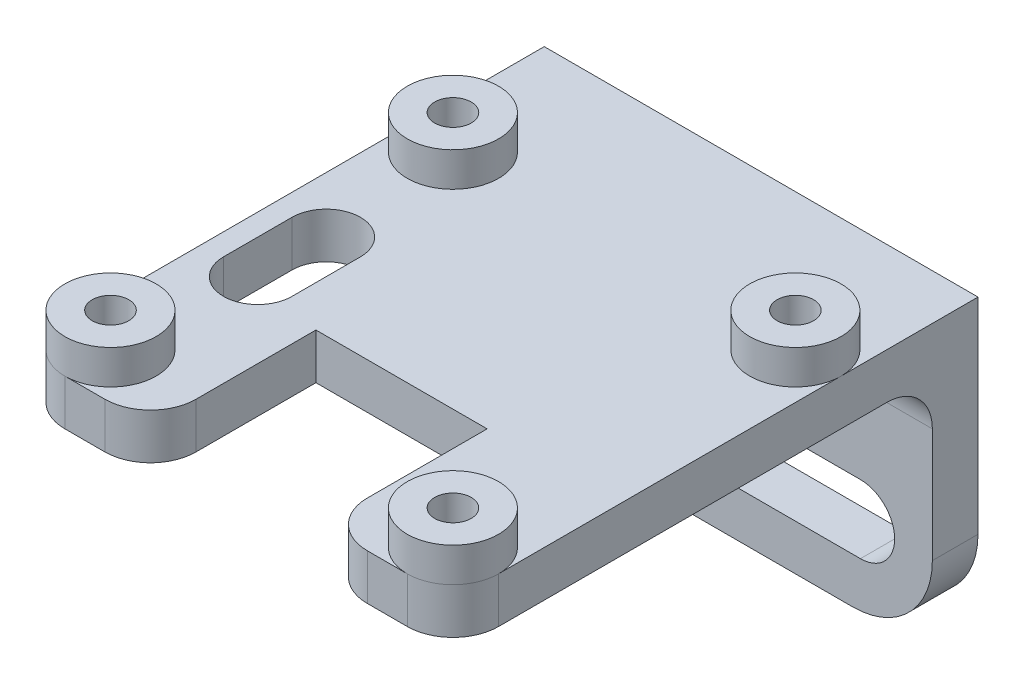
ISO-10303-21;
HEADER;
FILE_DESCRIPTION(('STEP AP214'),'2;1');
FILE_NAME('part.step','',(''),(''),'','','');
FILE_SCHEMA(('AUTOMOTIVE_DESIGN { 1 0 10303 214 1 1 1 1 }'));
ENDSEC;
DATA;
#1=APPLICATION_CONTEXT('core data for automotive mechanical design processes');
#2=APPLICATION_PROTOCOL_DEFINITION('international standard','automotive_design',2000,#1);
#3=PRODUCT_CONTEXT('',#1,'mechanical');
#4=PRODUCT('Part','Part','',(#3));
#5=PRODUCT_RELATED_PRODUCT_CATEGORY('part','',(#4));
#6=PRODUCT_DEFINITION_FORMATION('','',#4);
#7=PRODUCT_DEFINITION_CONTEXT('part definition',#1,'design');
#8=PRODUCT_DEFINITION('design','',#6,#7);
#9=PRODUCT_DEFINITION_SHAPE('','',#8);
#10=(LENGTH_UNIT() NAMED_UNIT(*) SI_UNIT(.MILLI.,.METRE.));
#11=(NAMED_UNIT(*) PLANE_ANGLE_UNIT() SI_UNIT($,.RADIAN.));
#12=(NAMED_UNIT(*) SI_UNIT($,.STERADIAN.) SOLID_ANGLE_UNIT());
#13=UNCERTAINTY_MEASURE_WITH_UNIT(LENGTH_MEASURE(1.E-05),#10,'distance_accuracy_value','');
#14=(GEOMETRIC_REPRESENTATION_CONTEXT(3) GLOBAL_UNCERTAINTY_ASSIGNED_CONTEXT((#13)) GLOBAL_UNIT_ASSIGNED_CONTEXT((#10,
#11,#12)) REPRESENTATION_CONTEXT('',''));
#15=CARTESIAN_POINT('',(0.,0.,0.));
#16=DIRECTION('',(0.,0.,1.));
#17=DIRECTION('',(1.,0.,0.));
#18=AXIS2_PLACEMENT_3D('',#15,#16,#17);
#19=CARTESIAN_POINT('',(-19.,-10.,7.));
#20=DIRECTION('',(0.,1.,0.));
#21=DIRECTION('',(0.,0.,1.));
#22=AXIS2_PLACEMENT_3D('',#19,#20,#21);
#23=PLANE('',#22);
#24=DIRECTION('',(1.,0.,0.));
#25=VECTOR('',#24,1.);
#26=CARTESIAN_POINT('',(-19.,-10.,4.));
#27=LINE('',#26,#25);
#28=CARTESIAN_POINT('',(-12.,-10.,4.));
#29=VERTEX_POINT('',#28);
#30=CARTESIAN_POINT('',(12.,-10.,4.));
#31=VERTEX_POINT('',#30);
#32=EDGE_CURVE('E325',#29,#31,#27,.T.);
#33=ORIENTED_EDGE('',*,*,#32,.F.);
#34=DIRECTION('',(0.,0.,-1.));
#35=VECTOR('',#34,1.);
#36=CARTESIAN_POINT('',(-12.,-10.,7.));
#37=LINE('',#36,#35);
#38=CARTESIAN_POINT('',(-12.,-10.,0.));
#39=VERTEX_POINT('',#38);
#40=EDGE_CURVE('E315',#29,#39,#37,.T.);
#41=ORIENTED_EDGE('',*,*,#40,.T.);
#42=DIRECTION('',(1.,0.,0.));
#43=VECTOR('',#42,1.);
#44=CARTESIAN_POINT('',(-19.,-10.,0.));
#45=LINE('',#44,#43);
#46=CARTESIAN_POINT('',(12.,-10.,0.));
#47=VERTEX_POINT('',#46);
#48=EDGE_CURVE('E257',#39,#47,#45,.T.);
#49=ORIENTED_EDGE('',*,*,#48,.T.);
#50=DIRECTION('',(0.,0.,-1.));
#51=VECTOR('',#50,1.);
#52=CARTESIAN_POINT('',(12.,-10.,7.));
#53=LINE('',#52,#51);
#54=EDGE_CURVE('E313',#47,#31,#53,.F.);
#55=ORIENTED_EDGE('',*,*,#54,.T.);
#56=EDGE_LOOP('',(#33,#41,#49,#55));
#57=FACE_BOUND('',#56,.T.);
#58=ADVANCED_FACE('F39',(#57),#23,.F.);
#59=CARTESIAN_POINT('',(-12.7,-3.,0.));
#60=DIRECTION('',(0.,0.,1.));
#61=DIRECTION('',(1.,0.,0.));
#62=AXIS2_PLACEMENT_3D('',#59,#60,#61);
#63=CYLINDRICAL_SURFACE('',#62,3.);
#64=CARTESIAN_POINT('',(-12.7,-3.,4.));
#65=DIRECTION('',(0.,0.,1.));
#66=DIRECTION('',(1.,0.,0.));
#67=AXIS2_PLACEMENT_3D('',#64,#65,#66);
#68=CIRCLE('',#67,3.);
#69=CARTESIAN_POINT('',(-12.7,-6.,4.));
#70=VERTEX_POINT('',#69);
#71=CARTESIAN_POINT('',(-12.7,0.,4.));
#72=VERTEX_POINT('',#71);
#73=EDGE_CURVE('E217',#70,#72,#68,.F.);
#74=ORIENTED_EDGE('',*,*,#73,.F.);
#75=DIRECTION('',(0.,0.,1.));
#76=VECTOR('',#75,1.);
#77=CARTESIAN_POINT('',(-12.7,-6.,0.));
#78=LINE('',#77,#76);
#79=CARTESIAN_POINT('',(-12.7,-6.,0.));
#80=VERTEX_POINT('',#79);
#81=EDGE_CURVE('E232',#80,#70,#78,.T.);
#82=ORIENTED_EDGE('',*,*,#81,.F.);
#83=CARTESIAN_POINT('',(-12.7,-3.,0.));
#84=DIRECTION('',(0.,0.,1.));
#85=DIRECTION('',(1.,0.,0.));
#86=AXIS2_PLACEMENT_3D('',#83,#84,#85);
#87=CIRCLE('',#86,3.);
#88=CARTESIAN_POINT('',(-12.7,0.,0.));
#89=VERTEX_POINT('',#88);
#90=EDGE_CURVE('E514',#89,#80,#87,.T.);
#91=ORIENTED_EDGE('',*,*,#90,.F.);
#92=DIRECTION('',(0.,0.,1.));
#93=VECTOR('',#92,1.);
#94=CARTESIAN_POINT('',(-12.7,0.,0.));
#95=LINE('',#94,#93);
#96=EDGE_CURVE('E234',#89,#72,#95,.T.);
#97=ORIENTED_EDGE('',*,*,#96,.T.);
#98=EDGE_LOOP('',(#74,#82,#91,#97));
#99=FACE_BOUND('',#98,.T.);
#100=ADVANCED_FACE('F230',(#99),#63,.F.);
#101=CARTESIAN_POINT('',(-12.7,0.,0.));
#102=DIRECTION('',(0.,1.,0.));
#103=DIRECTION('',(0.,0.,1.));
#104=AXIS2_PLACEMENT_3D('',#101,#102,#103);
#105=PLANE('',#104);
#106=DIRECTION('',(1.,0.,0.));
#107=VECTOR('',#106,1.);
#108=CARTESIAN_POINT('',(-12.7,0.,4.));
#109=LINE('',#108,#107);
#110=CARTESIAN_POINT('',(12.7,0.,4.));
#111=VERTEX_POINT('',#110);
#112=EDGE_CURVE('E236',#72,#111,#109,.T.);
#113=ORIENTED_EDGE('',*,*,#112,.F.);
#114=ORIENTED_EDGE('',*,*,#96,.F.);
#115=DIRECTION('',(-1.,0.,0.));
#116=VECTOR('',#115,1.);
#117=CARTESIAN_POINT('',(-12.7,0.,0.));
#118=LINE('',#117,#116);
#119=CARTESIAN_POINT('',(12.7,0.,0.));
#120=VERTEX_POINT('',#119);
#121=EDGE_CURVE('E243',#120,#89,#118,.T.);
#122=ORIENTED_EDGE('',*,*,#121,.F.);
#123=DIRECTION('',(0.,0.,1.));
#124=VECTOR('',#123,1.);
#125=CARTESIAN_POINT('',(12.7,0.,0.));
#126=LINE('',#125,#124);
#127=EDGE_CURVE('E245',#120,#111,#126,.T.);
#128=ORIENTED_EDGE('',*,*,#127,.T.);
#129=EDGE_LOOP('',(#113,#114,#122,#128));
#130=FACE_BOUND('',#129,.T.);
#131=ADVANCED_FACE('F367',(#130),#105,.F.);
#132=CARTESIAN_POINT('',(12.7,-3.,0.));
#133=DIRECTION('',(0.,0.,1.));
#134=DIRECTION('',(1.,0.,0.));
#135=AXIS2_PLACEMENT_3D('',#132,#133,#134);
#136=CYLINDRICAL_SURFACE('',#135,3.);
#137=CARTESIAN_POINT('',(12.7,-3.,4.));
#138=DIRECTION('',(0.,0.,1.));
#139=DIRECTION('',(1.,0.,0.));
#140=AXIS2_PLACEMENT_3D('',#137,#138,#139);
#141=CIRCLE('',#140,3.);
#142=CARTESIAN_POINT('',(12.7,-6.,4.));
#143=VERTEX_POINT('',#142);
#144=EDGE_CURVE('E220',#111,#143,#141,.F.);
#145=ORIENTED_EDGE('',*,*,#144,.F.);
#146=ORIENTED_EDGE('',*,*,#127,.F.);
#147=CARTESIAN_POINT('',(12.7,-3.,0.));
#148=DIRECTION('',(0.,0.,1.));
#149=DIRECTION('',(1.,0.,0.));
#150=AXIS2_PLACEMENT_3D('',#147,#148,#149);
#151=CIRCLE('',#150,3.);
#152=CARTESIAN_POINT('',(12.7,-6.,0.));
#153=VERTEX_POINT('',#152);
#154=EDGE_CURVE('E248',#153,#120,#151,.T.);
#155=ORIENTED_EDGE('',*,*,#154,.F.);
#156=DIRECTION('',(0.,0.,1.));
#157=VECTOR('',#156,1.);
#158=CARTESIAN_POINT('',(12.7,-6.,0.));
#159=LINE('',#158,#157);
#160=EDGE_CURVE('E242',#153,#143,#159,.T.);
#161=ORIENTED_EDGE('',*,*,#160,.T.);
#162=EDGE_LOOP('',(#145,#146,#155,#161));
#163=FACE_BOUND('',#162,.T.);
#164=ADVANCED_FACE('F525',(#163),#136,.F.);
#165=CARTESIAN_POINT('',(-12.7,-6.,0.));
#166=DIRECTION('',(0.,-1.,0.));
#167=DIRECTION('',(0.,0.,-1.));
#168=AXIS2_PLACEMENT_3D('',#165,#166,#167);
#169=PLANE('',#168);
#170=DIRECTION('',(-1.,0.,0.));
#171=VECTOR('',#170,1.);
#172=CARTESIAN_POINT('',(-12.7,-6.,4.));
#173=LINE('',#172,#171);
#174=EDGE_CURVE('E214',#143,#70,#173,.T.);
#175=ORIENTED_EDGE('',*,*,#174,.F.);
#176=ORIENTED_EDGE('',*,*,#160,.F.);
#177=DIRECTION('',(1.,0.,0.));
#178=VECTOR('',#177,1.);
#179=CARTESIAN_POINT('',(-12.7,-6.,0.));
#180=LINE('',#179,#178);
#181=EDGE_CURVE('E240',#80,#153,#180,.T.);
#182=ORIENTED_EDGE('',*,*,#181,.F.);
#183=ORIENTED_EDGE('',*,*,#81,.T.);
#184=EDGE_LOOP('',(#175,#176,#182,#183));
#185=FACE_BOUND('',#184,.T.);
#186=ADVANCED_FACE('F238',(#185),#169,.F.);
#187=CARTESIAN_POINT('',(0.,0.,46.));
#188=DIRECTION('',(0.,0.,1.));
#189=DIRECTION('',(1.,0.,0.));
#190=AXIS2_PLACEMENT_3D('',#187,#188,#189);
#191=PLANE('',#190);
#192=DIRECTION('',(-1.,0.,0.));
#193=VECTOR('',#192,1.);
#194=CARTESIAN_POINT('',(-7.5,11.,46.));
#195=LINE('',#194,#193);
#196=CARTESIAN_POINT('',(-11.5,11.,46.));
#197=VERTEX_POINT('',#196);
#198=CARTESIAN_POINT('',(-15.,11.,46.));
#199=VERTEX_POINT('',#198);
#200=EDGE_CURVE('E535',#197,#199,#195,.T.);
#201=ORIENTED_EDGE('',*,*,#200,.F.);
#202=DIRECTION('',(0.,-1.,0.));
#203=VECTOR('',#202,1.);
#204=CARTESIAN_POINT('',(-11.5,15.,46.));
#205=LINE('',#204,#203);
#206=CARTESIAN_POINT('',(-11.5,15.,46.));
#207=VERTEX_POINT('',#206);
#208=EDGE_CURVE('E295',#197,#207,#205,.F.);
#209=ORIENTED_EDGE('',*,*,#208,.T.);
#210=DIRECTION('',(-1.,0.,0.));
#211=VECTOR('',#210,1.);
#212=CARTESIAN_POINT('',(-19.,15.,46.));
#213=LINE('',#212,#211);
#214=CARTESIAN_POINT('',(-15.,15.,46.));
#215=VERTEX_POINT('',#214);
#216=EDGE_CURVE('E252',#207,#215,#213,.T.);
#217=ORIENTED_EDGE('',*,*,#216,.T.);
#218=DIRECTION('',(0.,-1.,0.));
#219=VECTOR('',#218,1.);
#220=CARTESIAN_POINT('',(-15.,11.,46.));
#221=LINE('',#220,#219);
#222=EDGE_CURVE('E292',#215,#199,#221,.T.);
#223=ORIENTED_EDGE('',*,*,#222,.T.);
#224=EDGE_LOOP('',(#201,#209,#217,#223));
#225=FACE_BOUND('',#224,.T.);
#226=ADVANCED_FACE('F564',(#225),#191,.T.);
#227=CARTESIAN_POINT('',(-19.,15.,7.));
#228=DIRECTION('',(0.,-1.,0.));
#229=DIRECTION('',(0.,0.,-1.));
#230=AXIS2_PLACEMENT_3D('',#227,#228,#229);
#231=PLANE('',#230);
#232=ORIENTED_EDGE('',*,*,#216,.F.);
#233=CARTESIAN_POINT('',(-11.5,15.,42.));
#234=DIRECTION('',(0.,-1.,0.));
#235=DIRECTION('',(0.,0.,-1.));
#236=AXIS2_PLACEMENT_3D('',#233,#234,#235);
#237=CIRCLE('',#236,4.);
#238=CARTESIAN_POINT('',(-7.5,15.,42.));
#239=VERTEX_POINT('',#238);
#240=EDGE_CURVE('E299',#207,#239,#237,.F.);
#241=ORIENTED_EDGE('',*,*,#240,.T.);
#242=DIRECTION('',(0.,0.,-1.));
#243=VECTOR('',#242,1.);
#244=CARTESIAN_POINT('',(-7.5,15.,7.));
#245=LINE('',#244,#243);
#246=CARTESIAN_POINT('',(-7.5,15.,31.5034545368798));
#247=VERTEX_POINT('',#246);
#248=EDGE_CURVE('E449',#239,#247,#245,.T.);
#249=ORIENTED_EDGE('',*,*,#248,.T.);
#250=DIRECTION('',(1.,0.,0.));
#251=VECTOR('',#250,1.);
#252=CARTESIAN_POINT('',(-19.,15.,31.5034545368798));
#253=LINE('',#252,#251);
#254=CARTESIAN_POINT('',(7.5,15.,31.5034545368798));
#255=VERTEX_POINT('',#254);
#256=EDGE_CURVE('E451',#247,#255,#253,.T.);
#257=ORIENTED_EDGE('',*,*,#256,.T.);
#258=DIRECTION('',(0.,0.,1.));
#259=VECTOR('',#258,1.);
#260=CARTESIAN_POINT('',(7.5,15.,7.));
#261=LINE('',#260,#259);
#262=CARTESIAN_POINT('',(7.5,15.,42.));
#263=VERTEX_POINT('',#262);
#264=EDGE_CURVE('E444',#255,#263,#261,.T.);
#265=ORIENTED_EDGE('',*,*,#264,.T.);
#266=CARTESIAN_POINT('',(11.5,15.,42.));
#267=DIRECTION('',(0.,-1.,0.));
#268=DIRECTION('',(0.,0.,-1.));
#269=AXIS2_PLACEMENT_3D('',#266,#267,#268);
#270=CIRCLE('',#269,4.);
#271=CARTESIAN_POINT('',(11.5,15.,46.));
#272=VERTEX_POINT('',#271);
#273=EDGE_CURVE('E297',#263,#272,#270,.F.);
#274=ORIENTED_EDGE('',*,*,#273,.T.);
#275=CARTESIAN_POINT('',(15.,15.,46.));
#276=VERTEX_POINT('',#275);
#277=EDGE_CURVE('E254',#276,#272,#213,.T.);
#278=ORIENTED_EDGE('',*,*,#277,.F.);
#279=CARTESIAN_POINT('',(15.,15.,42.));
#280=DIRECTION('',(0.,1.,0.));
#281=DIRECTION('',(0.,0.,1.));
#282=AXIS2_PLACEMENT_3D('',#279,#280,#281);
#283=CIRCLE('',#282,4.);
#284=CARTESIAN_POINT('',(19.,15.,42.));
#285=VERTEX_POINT('',#284);
#286=EDGE_CURVE('E502',#285,#276,#283,.T.);
#287=ORIENTED_EDGE('',*,*,#286,.F.);
#288=DIRECTION('',(0.,0.,-1.));
#289=VECTOR('',#288,1.);
#290=CARTESIAN_POINT('',(19.,15.,7.));
#291=LINE('',#290,#289);
#292=CARTESIAN_POINT('',(19.,15.,12.));
#293=VERTEX_POINT('',#292);
#294=EDGE_CURVE('E226',#285,#293,#291,.T.);
#295=ORIENTED_EDGE('',*,*,#294,.T.);
#296=CARTESIAN_POINT('',(15.,15.,12.));
#297=DIRECTION('',(0.,1.,0.));
#298=DIRECTION('',(0.,0.,1.));
#299=AXIS2_PLACEMENT_3D('',#296,#297,#298);
#300=CIRCLE('',#299,4.);
#301=EDGE_CURVE('E494',#293,#293,#300,.T.);
#302=ORIENTED_EDGE('',*,*,#301,.F.);
#303=CARTESIAN_POINT('',(19.,15.,0.));
#304=VERTEX_POINT('',#303);
#305=EDGE_CURVE('E268',#293,#304,#291,.T.);
#306=ORIENTED_EDGE('',*,*,#305,.T.);
#307=DIRECTION('',(-1.,0.,0.));
#308=VECTOR('',#307,1.);
#309=CARTESIAN_POINT('',(-19.,15.,0.));
#310=LINE('',#309,#308);
#311=CARTESIAN_POINT('',(-19.,15.,0.));
#312=VERTEX_POINT('',#311);
#313=EDGE_CURVE('E262',#304,#312,#310,.T.);
#314=ORIENTED_EDGE('',*,*,#313,.T.);
#315=DIRECTION('',(0.,0.,-1.));
#316=VECTOR('',#315,1.);
#317=CARTESIAN_POINT('',(-19.,15.,7.));
#318=LINE('',#317,#316);
#319=CARTESIAN_POINT('',(-19.,15.,12.));
#320=VERTEX_POINT('',#319);
#321=EDGE_CURVE('E265',#320,#312,#318,.T.);
#322=ORIENTED_EDGE('',*,*,#321,.F.);
#323=CARTESIAN_POINT('',(-15.,15.,12.));
#324=DIRECTION('',(0.,1.,0.));
#325=DIRECTION('',(0.,0.,1.));
#326=AXIS2_PLACEMENT_3D('',#323,#324,#325);
#327=CIRCLE('',#326,4.);
#328=EDGE_CURVE('E510',#320,#320,#327,.T.);
#329=ORIENTED_EDGE('',*,*,#328,.F.);
#330=CARTESIAN_POINT('',(-19.,15.,42.));
#331=VERTEX_POINT('',#330);
#332=EDGE_CURVE('E266',#331,#320,#318,.T.);
#333=ORIENTED_EDGE('',*,*,#332,.F.);
#334=CARTESIAN_POINT('',(-15.,15.,42.));
#335=DIRECTION('',(0.,1.,0.));
#336=DIRECTION('',(0.,0.,1.));
#337=AXIS2_PLACEMENT_3D('',#334,#335,#336);
#338=CIRCLE('',#337,4.);
#339=EDGE_CURVE('E488',#215,#331,#338,.T.);
#340=ORIENTED_EDGE('',*,*,#339,.F.);
#341=EDGE_LOOP('',(#232,#241,#249,#257,#265,#274,#278,#287,#295,#302,#306,#314,#322,#329,#333,#340));
#342=FACE_BOUND('',#341,.T.);
#343=DIRECTION('',(0.,0.,1.));
#344=VECTOR('',#343,1.);
#345=CARTESIAN_POINT('',(-11.1,15.,7.));
#346=LINE('',#345,#344);
#347=CARTESIAN_POINT('',(-11.1,15.,24.));
#348=VERTEX_POINT('',#347);
#349=CARTESIAN_POINT('',(-11.1,15.,30.));
#350=VERTEX_POINT('',#349);
#351=EDGE_CURVE('E472',#348,#350,#346,.T.);
#352=ORIENTED_EDGE('',*,*,#351,.T.);
#353=CARTESIAN_POINT('',(-14.1,15.,30.));
#354=DIRECTION('',(0.,-1.,0.));
#355=DIRECTION('',(0.,0.,-1.));
#356=AXIS2_PLACEMENT_3D('',#353,#354,#355);
#357=CIRCLE('',#356,3.);
#358=CARTESIAN_POINT('',(-17.1,15.,30.));
#359=VERTEX_POINT('',#358);
#360=EDGE_CURVE('E475',#350,#359,#357,.T.);
#361=ORIENTED_EDGE('',*,*,#360,.T.);
#362=DIRECTION('',(0.,0.,-1.));
#363=VECTOR('',#362,1.);
#364=CARTESIAN_POINT('',(-17.1,15.,7.));
#365=LINE('',#364,#363);
#366=CARTESIAN_POINT('',(-17.1,15.,24.));
#367=VERTEX_POINT('',#366);
#368=EDGE_CURVE('E458',#359,#367,#365,.T.);
#369=ORIENTED_EDGE('',*,*,#368,.T.);
#370=CARTESIAN_POINT('',(-14.1,15.,24.));
#371=DIRECTION('',(0.,-1.,0.));
#372=DIRECTION('',(0.,0.,-1.));
#373=AXIS2_PLACEMENT_3D('',#370,#371,#372);
#374=CIRCLE('',#373,3.);
#375=EDGE_CURVE('E469',#367,#348,#374,.T.);
#376=ORIENTED_EDGE('',*,*,#375,.T.);
#377=EDGE_LOOP('',(#352,#361,#369,#376));
#378=FACE_BOUND('',#377,.T.);
#379=ADVANCED_FACE('F345',(#342,#378),#231,.F.);
#380=CARTESIAN_POINT('',(-19.,15.,7.));
#381=DIRECTION('',(1.,0.,0.));
#382=DIRECTION('',(0.,0.,-1.));
#383=AXIS2_PLACEMENT_3D('',#380,#381,#382);
#384=PLANE('',#383);
#385=DIRECTION('',(0.,-1.,0.));
#386=VECTOR('',#385,1.);
#387=CARTESIAN_POINT('',(-19.,15.,0.));
#388=LINE('',#387,#386);
#389=CARTESIAN_POINT('',(-19.,-3.,0.));
#390=VERTEX_POINT('',#389);
#391=EDGE_CURVE('E255',#312,#390,#388,.T.);
#392=ORIENTED_EDGE('',*,*,#391,.T.);
#393=DIRECTION('',(0.,0.,-1.));
#394=VECTOR('',#393,1.);
#395=CARTESIAN_POINT('',(-19.,-3.,7.));
#396=LINE('',#395,#394);
#397=CARTESIAN_POINT('',(-19.,-3.,4.));
#398=VERTEX_POINT('',#397);
#399=EDGE_CURVE('E62',#390,#398,#396,.F.);
#400=ORIENTED_EDGE('',*,*,#399,.T.);
#401=DIRECTION('',(0.,-1.,0.));
#402=VECTOR('',#401,1.);
#403=CARTESIAN_POINT('',(-19.,11.,4.));
#404=LINE('',#403,#402);
#405=CARTESIAN_POINT('',(-19.,7.,4.));
#406=VERTEX_POINT('',#405);
#407=EDGE_CURVE('E326',#406,#398,#404,.T.);
#408=ORIENTED_EDGE('',*,*,#407,.F.);
#409=CARTESIAN_POINT('',(-19.,7.,8.));
#410=DIRECTION('',(1.,0.,0.));
#411=DIRECTION('',(0.,0.,-1.));
#412=AXIS2_PLACEMENT_3D('',#409,#410,#411);
#413=CIRCLE('',#412,4.);
#414=CARTESIAN_POINT('',(-19.,11.,8.));
#415=VERTEX_POINT('',#414);
#416=EDGE_CURVE('E275',#406,#415,#413,.T.);
#417=ORIENTED_EDGE('',*,*,#416,.T.);
#418=DIRECTION('',(0.,0.,-1.));
#419=VECTOR('',#418,1.);
#420=CARTESIAN_POINT('',(-19.,11.,46.));
#421=LINE('',#420,#419);
#422=CARTESIAN_POINT('',(-19.,11.,42.));
#423=VERTEX_POINT('',#422);
#424=EDGE_CURVE('E416',#423,#415,#421,.T.);
#425=ORIENTED_EDGE('',*,*,#424,.F.);
#426=DIRECTION('',(0.,-1.,0.));
#427=VECTOR('',#426,1.);
#428=CARTESIAN_POINT('',(-19.,15.,42.));
#429=LINE('',#428,#427);
#430=EDGE_CURVE('E309',#423,#331,#429,.F.);
#431=ORIENTED_EDGE('',*,*,#430,.T.);
#432=ORIENTED_EDGE('',*,*,#332,.T.);
#433=ORIENTED_EDGE('',*,*,#321,.T.);
#434=EDGE_LOOP('',(#392,#400,#408,#417,#425,#431,#432,#433));
#435=FACE_BOUND('',#434,.T.);
#436=ADVANCED_FACE('F339',(#435),#384,.F.);
#437=CARTESIAN_POINT('',(19.,15.,7.));
#438=DIRECTION('',(-1.,0.,0.));
#439=DIRECTION('',(0.,0.,1.));
#440=AXIS2_PLACEMENT_3D('',#437,#438,#439);
#441=PLANE('',#440);
#442=DIRECTION('',(0.,1.,0.));
#443=VECTOR('',#442,1.);
#444=CARTESIAN_POINT('',(19.,-10.,4.));
#445=LINE('',#444,#443);
#446=CARTESIAN_POINT('',(19.,-3.,4.));
#447=VERTEX_POINT('',#446);
#448=CARTESIAN_POINT('',(19.,7.,4.));
#449=VERTEX_POINT('',#448);
#450=EDGE_CURVE('E332',#447,#449,#445,.T.);
#451=ORIENTED_EDGE('',*,*,#450,.F.);
#452=DIRECTION('',(0.,0.,-1.));
#453=VECTOR('',#452,1.);
#454=CARTESIAN_POINT('',(19.,-3.,7.));
#455=LINE('',#454,#453);
#456=CARTESIAN_POINT('',(19.,-3.,0.));
#457=VERTEX_POINT('',#456);
#458=EDGE_CURVE('E11',#447,#457,#455,.T.);
#459=ORIENTED_EDGE('',*,*,#458,.T.);
#460=DIRECTION('',(0.,1.,0.));
#461=VECTOR('',#460,1.);
#462=CARTESIAN_POINT('',(19.,15.,0.));
#463=LINE('',#462,#461);
#464=EDGE_CURVE('E260',#457,#304,#463,.T.);
#465=ORIENTED_EDGE('',*,*,#464,.T.);
#466=ORIENTED_EDGE('',*,*,#305,.F.);
#467=ORIENTED_EDGE('',*,*,#294,.F.);
#468=DIRECTION('',(0.,1.,0.));
#469=VECTOR('',#468,1.);
#470=CARTESIAN_POINT('',(19.,11.,42.));
#471=LINE('',#470,#469);
#472=CARTESIAN_POINT('',(19.,11.,42.));
#473=VERTEX_POINT('',#472);
#474=EDGE_CURVE('E311',#285,#473,#471,.F.);
#475=ORIENTED_EDGE('',*,*,#474,.T.);
#476=DIRECTION('',(0.,0.,1.));
#477=VECTOR('',#476,1.);
#478=CARTESIAN_POINT('',(19.,11.,7.));
#479=LINE('',#478,#477);
#480=CARTESIAN_POINT('',(19.,11.,8.));
#481=VERTEX_POINT('',#480);
#482=EDGE_CURVE('E405',#481,#473,#479,.T.);
#483=ORIENTED_EDGE('',*,*,#482,.F.);
#484=CARTESIAN_POINT('',(19.,7.,8.));
#485=DIRECTION('',(-1.,0.,0.));
#486=DIRECTION('',(0.,0.,1.));
#487=AXIS2_PLACEMENT_3D('',#484,#485,#486);
#488=CIRCLE('',#487,4.);
#489=EDGE_CURVE('E278',#481,#449,#488,.T.);
#490=ORIENTED_EDGE('',*,*,#489,.T.);
#491=EDGE_LOOP('',(#451,#459,#465,#466,#467,#475,#483,#490));
#492=FACE_BOUND('',#491,.T.);
#493=ADVANCED_FACE('F351',(#492),#441,.F.);
#494=CARTESIAN_POINT('',(0.,0.,0.));
#495=DIRECTION('',(0.,0.,1.));
#496=DIRECTION('',(1.,0.,0.));
#497=AXIS2_PLACEMENT_3D('',#494,#495,#496);
#498=PLANE('',#497);
#499=ORIENTED_EDGE('',*,*,#121,.T.);
#500=ORIENTED_EDGE('',*,*,#90,.T.);
#501=ORIENTED_EDGE('',*,*,#181,.T.);
#502=ORIENTED_EDGE('',*,*,#154,.T.);
#503=EDGE_LOOP('',(#499,#500,#501,#502));
#504=FACE_BOUND('',#503,.T.);
#505=ORIENTED_EDGE('',*,*,#48,.F.);
#506=CARTESIAN_POINT('',(-12.,-3.,0.));
#507=DIRECTION('',(0.,0.,1.));
#508=DIRECTION('',(1.,0.,0.));
#509=AXIS2_PLACEMENT_3D('',#506,#507,#508);
#510=CIRCLE('',#509,7.);
#511=EDGE_CURVE('E320',#39,#390,#510,.F.);
#512=ORIENTED_EDGE('',*,*,#511,.T.);
#513=ORIENTED_EDGE('',*,*,#391,.F.);
#514=ORIENTED_EDGE('',*,*,#313,.F.);
#515=ORIENTED_EDGE('',*,*,#464,.F.);
#516=CARTESIAN_POINT('',(12.,-3.,0.));
#517=DIRECTION('',(0.,0.,1.));
#518=DIRECTION('',(1.,0.,0.));
#519=AXIS2_PLACEMENT_3D('',#516,#517,#518);
#520=CIRCLE('',#519,7.);
#521=EDGE_CURVE('E318',#457,#47,#520,.F.);
#522=ORIENTED_EDGE('',*,*,#521,.T.);
#523=EDGE_LOOP('',(#505,#512,#513,#514,#515,#522));
#524=FACE_BOUND('',#523,.T.);
#525=ADVANCED_FACE('F337',(#504,#524),#498,.F.);
#526=ORIENTED_EDGE('',*,*,#277,.T.);
#527=DIRECTION('',(0.,1.,0.));
#528=VECTOR('',#527,1.);
#529=CARTESIAN_POINT('',(11.5,11.,46.));
#530=LINE('',#529,#528);
#531=CARTESIAN_POINT('',(11.5,11.,46.));
#532=VERTEX_POINT('',#531);
#533=EDGE_CURVE('E307',#272,#532,#530,.F.);
#534=ORIENTED_EDGE('',*,*,#533,.T.);
#535=DIRECTION('',(-1.,0.,0.));
#536=VECTOR('',#535,1.);
#537=CARTESIAN_POINT('',(19.,11.,46.));
#538=LINE('',#537,#536);
#539=CARTESIAN_POINT('',(15.,11.,46.));
#540=VERTEX_POINT('',#539);
#541=EDGE_CURVE('E402',#540,#532,#538,.T.);
#542=ORIENTED_EDGE('',*,*,#541,.F.);
#543=DIRECTION('',(0.,1.,0.));
#544=VECTOR('',#543,1.);
#545=CARTESIAN_POINT('',(15.,15.,46.));
#546=LINE('',#545,#544);
#547=EDGE_CURVE('E304',#540,#276,#546,.T.);
#548=ORIENTED_EDGE('',*,*,#547,.T.);
#549=EDGE_LOOP('',(#526,#534,#542,#548));
#550=FACE_BOUND('',#549,.T.);
#551=ADVANCED_FACE('F408',(#550),#191,.T.);
#552=CARTESIAN_POINT('',(-15.,-10.,12.));
#553=DIRECTION('',(0.,1.,0.));
#554=DIRECTION('',(0.,0.,1.));
#555=AXIS2_PLACEMENT_3D('',#552,#553,#554);
#556=CYLINDRICAL_SURFACE('',#555,1.6);
#557=CARTESIAN_POINT('',(-15.,11.,12.));
#558=DIRECTION('',(0.,1.,0.));
#559=DIRECTION('',(0.,0.,1.));
#560=AXIS2_PLACEMENT_3D('',#557,#558,#559);
#561=CIRCLE('',#560,1.6);
#562=CARTESIAN_POINT('',(-15.,11.,13.6));
#563=VERTEX_POINT('',#562);
#564=EDGE_CURVE('E437',#563,#563,#561,.F.);
#565=ORIENTED_EDGE('',*,*,#564,.T.);
#566=EDGE_LOOP('',(#565));
#567=FACE_BOUND('',#566,.T.);
#568=CARTESIAN_POINT('',(-15.,18.,12.));
#569=DIRECTION('',(0.,1.,0.));
#570=DIRECTION('',(0.,0.,1.));
#571=AXIS2_PLACEMENT_3D('',#568,#569,#570);
#572=CIRCLE('',#571,1.6);
#573=CARTESIAN_POINT('',(-15.,18.,13.6));
#574=VERTEX_POINT('',#573);
#575=EDGE_CURVE('E487',#574,#574,#572,.T.);
#576=ORIENTED_EDGE('',*,*,#575,.T.);
#577=EDGE_LOOP('',(#576));
#578=FACE_BOUND('',#577,.T.);
#579=ADVANCED_FACE('F616',(#567,#578),#556,.F.);
#580=CARTESIAN_POINT('',(-15.,18.,12.));
#581=DIRECTION('',(0.,1.,0.));
#582=DIRECTION('',(0.,0.,1.));
#583=AXIS2_PLACEMENT_3D('',#580,#581,#582);
#584=PLANE('',#583);
#585=CARTESIAN_POINT('',(-15.,18.,12.));
#586=DIRECTION('',(0.,1.,0.));
#587=DIRECTION('',(0.,0.,1.));
#588=AXIS2_PLACEMENT_3D('',#585,#586,#587);
#589=CIRCLE('',#588,4.);
#590=CARTESIAN_POINT('',(-15.,18.,16.));
#591=VERTEX_POINT('',#590);
#592=EDGE_CURVE('E511',#591,#591,#589,.T.);
#593=ORIENTED_EDGE('',*,*,#592,.T.);
#594=EDGE_LOOP('',(#593));
#595=FACE_BOUND('',#594,.T.);
#596=ORIENTED_EDGE('',*,*,#575,.F.);
#597=EDGE_LOOP('',(#596));
#598=FACE_BOUND('',#597,.T.);
#599=ADVANCED_FACE('F613',(#595,#598),#584,.T.);
#600=CARTESIAN_POINT('',(-15.,18.,12.));
#601=DIRECTION('',(0.,-1.,0.));
#602=DIRECTION('',(0.,0.,-1.));
#603=AXIS2_PLACEMENT_3D('',#600,#601,#602);
#604=CYLINDRICAL_SURFACE('',#603,4.);
#605=ORIENTED_EDGE('',*,*,#592,.F.);
#606=EDGE_LOOP('',(#605));
#607=FACE_BOUND('',#606,.T.);
#608=ORIENTED_EDGE('',*,*,#328,.T.);
#609=EDGE_LOOP('',(#608));
#610=FACE_BOUND('',#609,.T.);
#611=ADVANCED_FACE('F611',(#607,#610),#604,.T.);
#612=CARTESIAN_POINT('',(15.,-10.,42.));
#613=DIRECTION('',(0.,1.,0.));
#614=DIRECTION('',(0.,0.,1.));
#615=AXIS2_PLACEMENT_3D('',#612,#613,#614);
#616=CYLINDRICAL_SURFACE('',#615,1.6);
#617=CARTESIAN_POINT('',(15.,11.,42.));
#618=DIRECTION('',(0.,1.,0.));
#619=DIRECTION('',(0.,0.,1.));
#620=AXIS2_PLACEMENT_3D('',#617,#618,#619);
#621=CIRCLE('',#620,1.6);
#622=CARTESIAN_POINT('',(15.,11.,43.6));
#623=VERTEX_POINT('',#622);
#624=EDGE_CURVE('E434',#623,#623,#621,.F.);
#625=ORIENTED_EDGE('',*,*,#624,.T.);
#626=EDGE_LOOP('',(#625));
#627=FACE_BOUND('',#626,.T.);
#628=CARTESIAN_POINT('',(15.,18.,42.));
#629=DIRECTION('',(0.,1.,0.));
#630=DIRECTION('',(0.,0.,1.));
#631=AXIS2_PLACEMENT_3D('',#628,#629,#630);
#632=CIRCLE('',#631,1.6);
#633=CARTESIAN_POINT('',(15.,18.,43.6));
#634=VERTEX_POINT('',#633);
#635=EDGE_CURVE('E478',#634,#634,#632,.T.);
#636=ORIENTED_EDGE('',*,*,#635,.T.);
#637=EDGE_LOOP('',(#636));
#638=FACE_BOUND('',#637,.T.);
#639=ADVANCED_FACE('F607',(#627,#638),#616,.F.);
#640=CARTESIAN_POINT('',(15.,-10.,12.));
#641=DIRECTION('',(0.,1.,0.));
#642=DIRECTION('',(0.,0.,1.));
#643=AXIS2_PLACEMENT_3D('',#640,#641,#642);
#644=CYLINDRICAL_SURFACE('',#643,1.6);
#645=CARTESIAN_POINT('',(15.,11.,12.));
#646=DIRECTION('',(0.,1.,0.));
#647=DIRECTION('',(0.,0.,1.));
#648=AXIS2_PLACEMENT_3D('',#645,#646,#647);
#649=CIRCLE('',#648,1.6);
#650=CARTESIAN_POINT('',(15.,11.,13.6));
#651=VERTEX_POINT('',#650);
#652=EDGE_CURVE('E431',#651,#651,#649,.F.);
#653=ORIENTED_EDGE('',*,*,#652,.T.);
#654=EDGE_LOOP('',(#653));
#655=FACE_BOUND('',#654,.T.);
#656=CARTESIAN_POINT('',(15.,18.,12.));
#657=DIRECTION('',(0.,1.,0.));
#658=DIRECTION('',(0.,0.,1.));
#659=AXIS2_PLACEMENT_3D('',#656,#657,#658);
#660=CIRCLE('',#659,1.6);
#661=CARTESIAN_POINT('',(15.,18.,13.6));
#662=VERTEX_POINT('',#661);
#663=EDGE_CURVE('E491',#662,#662,#660,.T.);
#664=ORIENTED_EDGE('',*,*,#663,.T.);
#665=EDGE_LOOP('',(#664));
#666=FACE_BOUND('',#665,.T.);
#667=ADVANCED_FACE('F603',(#655,#666),#644,.F.);
#668=CARTESIAN_POINT('',(-15.,-10.,42.));
#669=DIRECTION('',(0.,1.,0.));
#670=DIRECTION('',(0.,0.,1.));
#671=AXIS2_PLACEMENT_3D('',#668,#669,#670);
#672=CYLINDRICAL_SURFACE('',#671,1.6);
#673=CARTESIAN_POINT('',(-15.,11.,42.));
#674=DIRECTION('',(0.,1.,0.));
#675=DIRECTION('',(0.,0.,1.));
#676=AXIS2_PLACEMENT_3D('',#673,#674,#675);
#677=CIRCLE('',#676,1.6);
#678=CARTESIAN_POINT('',(-15.,11.,43.6));
#679=VERTEX_POINT('',#678);
#680=EDGE_CURVE('E428',#679,#679,#677,.F.);
#681=ORIENTED_EDGE('',*,*,#680,.T.);
#682=EDGE_LOOP('',(#681));
#683=FACE_BOUND('',#682,.T.);
#684=CARTESIAN_POINT('',(-15.,18.,42.));
#685=DIRECTION('',(0.,1.,0.));
#686=DIRECTION('',(0.,0.,1.));
#687=AXIS2_PLACEMENT_3D('',#684,#685,#686);
#688=CIRCLE('',#687,1.6);
#689=CARTESIAN_POINT('',(-15.,18.,43.6));
#690=VERTEX_POINT('',#689);
#691=EDGE_CURVE('E479',#690,#690,#688,.T.);
#692=ORIENTED_EDGE('',*,*,#691,.T.);
#693=EDGE_LOOP('',(#692));
#694=FACE_BOUND('',#693,.T.);
#695=ADVANCED_FACE('F585',(#683,#694),#672,.F.);
#696=CARTESIAN_POINT('',(-15.,18.,42.));
#697=DIRECTION('',(0.,1.,0.));
#698=DIRECTION('',(0.,0.,1.));
#699=AXIS2_PLACEMENT_3D('',#696,#697,#698);
#700=PLANE('',#699);
#701=CARTESIAN_POINT('',(-15.,18.,42.));
#702=DIRECTION('',(0.,1.,0.));
#703=DIRECTION('',(0.,0.,1.));
#704=AXIS2_PLACEMENT_3D('',#701,#702,#703);
#705=CIRCLE('',#704,4.);
#706=CARTESIAN_POINT('',(-15.,18.,46.));
#707=VERTEX_POINT('',#706);
#708=EDGE_CURVE('E484',#707,#707,#705,.T.);
#709=ORIENTED_EDGE('',*,*,#708,.T.);
#710=EDGE_LOOP('',(#709));
#711=FACE_BOUND('',#710,.T.);
#712=ORIENTED_EDGE('',*,*,#691,.F.);
#713=EDGE_LOOP('',(#712));
#714=FACE_BOUND('',#713,.T.);
#715=ADVANCED_FACE('F573',(#711,#714),#700,.T.);
#716=CARTESIAN_POINT('',(-15.,18.,42.));
#717=DIRECTION('',(0.,-1.,0.));
#718=DIRECTION('',(0.,0.,-1.));
#719=AXIS2_PLACEMENT_3D('',#716,#717,#718);
#720=CYLINDRICAL_SURFACE('',#719,4.);
#721=ORIENTED_EDGE('',*,*,#708,.F.);
#722=EDGE_LOOP('',(#721));
#723=FACE_BOUND('',#722,.T.);
#724=ORIENTED_EDGE('',*,*,#339,.T.);
#725=EDGE_CURVE('E482',#331,#215,#338,.T.);
#726=ORIENTED_EDGE('',*,*,#725,.T.);
#727=EDGE_LOOP('',(#724,#726));
#728=FACE_BOUND('',#727,.T.);
#729=ADVANCED_FACE('F570',(#723,#728),#720,.T.);
#730=CARTESIAN_POINT('',(15.,18.,12.));
#731=DIRECTION('',(0.,1.,0.));
#732=DIRECTION('',(0.,0.,1.));
#733=AXIS2_PLACEMENT_3D('',#730,#731,#732);
#734=PLANE('',#733);
#735=CARTESIAN_POINT('',(15.,18.,12.));
#736=DIRECTION('',(0.,1.,0.));
#737=DIRECTION('',(0.,0.,1.));
#738=AXIS2_PLACEMENT_3D('',#735,#736,#737);
#739=CIRCLE('',#738,4.);
#740=CARTESIAN_POINT('',(15.,18.,16.));
#741=VERTEX_POINT('',#740);
#742=EDGE_CURVE('E483',#741,#741,#739,.T.);
#743=ORIENTED_EDGE('',*,*,#742,.T.);
#744=EDGE_LOOP('',(#743));
#745=FACE_BOUND('',#744,.T.);
#746=ORIENTED_EDGE('',*,*,#663,.F.);
#747=EDGE_LOOP('',(#746));
#748=FACE_BOUND('',#747,.T.);
#749=ADVANCED_FACE('F572',(#745,#748),#734,.T.);
#750=CARTESIAN_POINT('',(15.,18.,12.));
#751=DIRECTION('',(0.,-1.,0.));
#752=DIRECTION('',(0.,0.,-1.));
#753=AXIS2_PLACEMENT_3D('',#750,#751,#752);
#754=CYLINDRICAL_SURFACE('',#753,4.);
#755=ORIENTED_EDGE('',*,*,#742,.F.);
#756=EDGE_LOOP('',(#755));
#757=FACE_BOUND('',#756,.T.);
#758=ORIENTED_EDGE('',*,*,#301,.T.);
#759=EDGE_LOOP('',(#758));
#760=FACE_BOUND('',#759,.T.);
#761=ADVANCED_FACE('F581',(#757,#760),#754,.T.);
#762=CARTESIAN_POINT('',(15.,18.,42.));
#763=DIRECTION('',(0.,1.,0.));
#764=DIRECTION('',(0.,0.,1.));
#765=AXIS2_PLACEMENT_3D('',#762,#763,#764);
#766=PLANE('',#765);
#767=CARTESIAN_POINT('',(15.,18.,42.));
#768=DIRECTION('',(0.,1.,0.));
#769=DIRECTION('',(0.,0.,1.));
#770=AXIS2_PLACEMENT_3D('',#767,#768,#769);
#771=CIRCLE('',#770,4.);
#772=CARTESIAN_POINT('',(15.,18.,46.));
#773=VERTEX_POINT('',#772);
#774=EDGE_CURVE('E495',#773,#773,#771,.T.);
#775=ORIENTED_EDGE('',*,*,#774,.T.);
#776=EDGE_LOOP('',(#775));
#777=FACE_BOUND('',#776,.T.);
#778=ORIENTED_EDGE('',*,*,#635,.F.);
#779=EDGE_LOOP('',(#778));
#780=FACE_BOUND('',#779,.T.);
#781=ADVANCED_FACE('F593',(#777,#780),#766,.T.);
#782=CARTESIAN_POINT('',(15.,18.,42.));
#783=DIRECTION('',(0.,-1.,0.));
#784=DIRECTION('',(0.,0.,-1.));
#785=AXIS2_PLACEMENT_3D('',#782,#783,#784);
#786=CYLINDRICAL_SURFACE('',#785,4.);
#787=ORIENTED_EDGE('',*,*,#774,.F.);
#788=EDGE_LOOP('',(#787));
#789=FACE_BOUND('',#788,.T.);
#790=EDGE_CURVE('E505',#276,#285,#283,.T.);
#791=ORIENTED_EDGE('',*,*,#790,.T.);
#792=ORIENTED_EDGE('',*,*,#286,.T.);
#793=EDGE_LOOP('',(#791,#792));
#794=FACE_BOUND('',#793,.T.);
#795=ADVANCED_FACE('F544',(#789,#794),#786,.T.);
#796=CARTESIAN_POINT('',(-14.1,18.,30.));
#797=DIRECTION('',(0.,-1.,0.));
#798=DIRECTION('',(0.,0.,-1.));
#799=AXIS2_PLACEMENT_3D('',#796,#797,#798);
#800=CYLINDRICAL_SURFACE('',#799,3.);
#801=DIRECTION('',(0.,-1.,0.));
#802=VECTOR('',#801,1.);
#803=CARTESIAN_POINT('',(-11.1,18.,30.));
#804=LINE('',#803,#802);
#805=CARTESIAN_POINT('',(-11.1,11.,30.));
#806=VERTEX_POINT('',#805);
#807=EDGE_CURVE('E455',#350,#806,#804,.T.);
#808=ORIENTED_EDGE('',*,*,#807,.T.);
#809=CARTESIAN_POINT('',(-14.1,11.,30.));
#810=DIRECTION('',(0.,1.,0.));
#811=DIRECTION('',(0.,0.,1.));
#812=AXIS2_PLACEMENT_3D('',#809,#810,#811);
#813=CIRCLE('',#812,3.);
#814=CARTESIAN_POINT('',(-17.1,11.,30.));
#815=VERTEX_POINT('',#814);
#816=EDGE_CURVE('E425',#806,#815,#813,.F.);
#817=ORIENTED_EDGE('',*,*,#816,.T.);
#818=DIRECTION('',(0.,-1.,0.));
#819=VECTOR('',#818,1.);
#820=CARTESIAN_POINT('',(-17.1,18.,30.));
#821=LINE('',#820,#819);
#822=EDGE_CURVE('E454',#359,#815,#821,.T.);
#823=ORIENTED_EDGE('',*,*,#822,.F.);
#824=ORIENTED_EDGE('',*,*,#360,.F.);
#825=EDGE_LOOP('',(#808,#817,#823,#824));
#826=FACE_BOUND('',#825,.T.);
#827=ADVANCED_FACE('F599',(#826),#800,.F.);
#828=CARTESIAN_POINT('',(-11.1,18.,30.));
#829=DIRECTION('',(1.,0.,0.));
#830=DIRECTION('',(0.,0.,-1.));
#831=AXIS2_PLACEMENT_3D('',#828,#829,#830);
#832=PLANE('',#831);
#833=DIRECTION('',(0.,-1.,0.));
#834=VECTOR('',#833,1.);
#835=CARTESIAN_POINT('',(-11.1,18.,24.));
#836=LINE('',#835,#834);
#837=CARTESIAN_POINT('',(-11.1,11.,24.));
#838=VERTEX_POINT('',#837);
#839=EDGE_CURVE('E459',#348,#838,#836,.T.);
#840=ORIENTED_EDGE('',*,*,#839,.T.);
#841=DIRECTION('',(0.,0.,1.));
#842=VECTOR('',#841,1.);
#843=CARTESIAN_POINT('',(-11.1,11.,30.));
#844=LINE('',#843,#842);
#845=EDGE_CURVE('E422',#838,#806,#844,.T.);
#846=ORIENTED_EDGE('',*,*,#845,.T.);
#847=ORIENTED_EDGE('',*,*,#807,.F.);
#848=ORIENTED_EDGE('',*,*,#351,.F.);
#849=EDGE_LOOP('',(#840,#846,#847,#848));
#850=FACE_BOUND('',#849,.T.);
#851=ADVANCED_FACE('F687',(#850),#832,.F.);
#852=CARTESIAN_POINT('',(-14.1,18.,24.));
#853=DIRECTION('',(0.,-1.,0.));
#854=DIRECTION('',(0.,0.,-1.));
#855=AXIS2_PLACEMENT_3D('',#852,#853,#854);
#856=CYLINDRICAL_SURFACE('',#855,3.);
#857=DIRECTION('',(0.,-1.,0.));
#858=VECTOR('',#857,1.);
#859=CARTESIAN_POINT('',(-17.1,18.,24.));
#860=LINE('',#859,#858);
#861=CARTESIAN_POINT('',(-17.1,11.,24.));
#862=VERTEX_POINT('',#861);
#863=EDGE_CURVE('E462',#367,#862,#860,.T.);
#864=ORIENTED_EDGE('',*,*,#863,.T.);
#865=CARTESIAN_POINT('',(-14.1,11.,24.));
#866=DIRECTION('',(0.,1.,0.));
#867=DIRECTION('',(0.,0.,1.));
#868=AXIS2_PLACEMENT_3D('',#865,#866,#867);
#869=CIRCLE('',#868,3.);
#870=EDGE_CURVE('E414',#862,#838,#869,.F.);
#871=ORIENTED_EDGE('',*,*,#870,.T.);
#872=ORIENTED_EDGE('',*,*,#839,.F.);
#873=ORIENTED_EDGE('',*,*,#375,.F.);
#874=EDGE_LOOP('',(#864,#871,#872,#873));
#875=FACE_BOUND('',#874,.T.);
#876=ADVANCED_FACE('F679',(#875),#856,.F.);
#877=CARTESIAN_POINT('',(-17.1,18.,30.));
#878=DIRECTION('',(-1.,0.,0.));
#879=DIRECTION('',(0.,0.,1.));
#880=AXIS2_PLACEMENT_3D('',#877,#878,#879);
#881=PLANE('',#880);
#882=ORIENTED_EDGE('',*,*,#822,.T.);
#883=DIRECTION('',(0.,0.,-1.));
#884=VECTOR('',#883,1.);
#885=CARTESIAN_POINT('',(-17.1,11.,30.));
#886=LINE('',#885,#884);
#887=EDGE_CURVE('E411',#815,#862,#886,.T.);
#888=ORIENTED_EDGE('',*,*,#887,.T.);
#889=ORIENTED_EDGE('',*,*,#863,.F.);
#890=ORIENTED_EDGE('',*,*,#368,.F.);
#891=EDGE_LOOP('',(#882,#888,#889,#890));
#892=FACE_BOUND('',#891,.T.);
#893=ADVANCED_FACE('F671',(#892),#881,.F.);
#894=CARTESIAN_POINT('',(-7.5,18.,31.5034545368798));
#895=DIRECTION('',(0.,0.,-1.));
#896=DIRECTION('',(-1.,0.,0.));
#897=AXIS2_PLACEMENT_3D('',#894,#895,#896);
#898=PLANE('',#897);
#899=DIRECTION('',(0.,-1.,0.));
#900=VECTOR('',#899,1.);
#901=CARTESIAN_POINT('',(-7.5,18.,31.5034545368798));
#902=LINE('',#901,#900);
#903=CARTESIAN_POINT('',(-7.5,11.,31.5034545368798));
#904=VERTEX_POINT('',#903);
#905=EDGE_CURVE('E440',#247,#904,#902,.T.);
#906=ORIENTED_EDGE('',*,*,#905,.T.);
#907=DIRECTION('',(-1.,0.,0.));
#908=VECTOR('',#907,1.);
#909=CARTESIAN_POINT('',(7.5,11.,31.5034545368798));
#910=LINE('',#909,#908);
#911=CARTESIAN_POINT('',(7.5,11.,31.5034545368798));
#912=VERTEX_POINT('',#911);
#913=EDGE_CURVE('E531',#912,#904,#910,.T.);
#914=ORIENTED_EDGE('',*,*,#913,.F.);
#915=DIRECTION('',(0.,-1.,0.));
#916=VECTOR('',#915,1.);
#917=CARTESIAN_POINT('',(7.5,18.,31.5034545368798));
#918=LINE('',#917,#916);
#919=EDGE_CURVE('E441',#255,#912,#918,.T.);
#920=ORIENTED_EDGE('',*,*,#919,.F.);
#921=ORIENTED_EDGE('',*,*,#256,.F.);
#922=EDGE_LOOP('',(#906,#914,#920,#921));
#923=FACE_BOUND('',#922,.T.);
#924=ADVANCED_FACE('F553',(#923),#898,.F.);
#925=CARTESIAN_POINT('',(-7.5,18.,46.));
#926=DIRECTION('',(-1.,0.,0.));
#927=DIRECTION('',(0.,0.,1.));
#928=AXIS2_PLACEMENT_3D('',#925,#926,#927);
#929=PLANE('',#928);
#930=ORIENTED_EDGE('',*,*,#248,.F.);
#931=DIRECTION('',(0.,-1.,0.));
#932=VECTOR('',#931,1.);
#933=CARTESIAN_POINT('',(-7.5,11.,42.));
#934=LINE('',#933,#932);
#935=CARTESIAN_POINT('',(-7.5,11.,42.));
#936=VERTEX_POINT('',#935);
#937=EDGE_CURVE('E281',#239,#936,#934,.T.);
#938=ORIENTED_EDGE('',*,*,#937,.T.);
#939=DIRECTION('',(0.,0.,1.));
#940=VECTOR('',#939,1.);
#941=CARTESIAN_POINT('',(-7.5,11.,31.5034545368798));
#942=LINE('',#941,#940);
#943=EDGE_CURVE('E533',#904,#936,#942,.T.);
#944=ORIENTED_EDGE('',*,*,#943,.F.);
#945=ORIENTED_EDGE('',*,*,#905,.F.);
#946=EDGE_LOOP('',(#930,#938,#944,#945));
#947=FACE_BOUND('',#946,.T.);
#948=ADVANCED_FACE('F559',(#947),#929,.F.);
#949=CARTESIAN_POINT('',(7.5,18.,46.));
#950=DIRECTION('',(1.,0.,0.));
#951=DIRECTION('',(0.,0.,-1.));
#952=AXIS2_PLACEMENT_3D('',#949,#950,#951);
#953=PLANE('',#952);
#954=DIRECTION('',(0.,0.,-1.));
#955=VECTOR('',#954,1.);
#956=CARTESIAN_POINT('',(7.5,11.,46.));
#957=LINE('',#956,#955);
#958=CARTESIAN_POINT('',(7.5,11.,42.));
#959=VERTEX_POINT('',#958);
#960=EDGE_CURVE('E235',#959,#912,#957,.T.);
#961=ORIENTED_EDGE('',*,*,#960,.F.);
#962=DIRECTION('',(0.,1.,0.));
#963=VECTOR('',#962,1.);
#964=CARTESIAN_POINT('',(7.5,15.,42.));
#965=LINE('',#964,#963);
#966=EDGE_CURVE('E301',#959,#263,#965,.T.);
#967=ORIENTED_EDGE('',*,*,#966,.T.);
#968=ORIENTED_EDGE('',*,*,#264,.F.);
#969=ORIENTED_EDGE('',*,*,#919,.T.);
#970=EDGE_LOOP('',(#961,#967,#968,#969));
#971=FACE_BOUND('',#970,.T.);
#972=ADVANCED_FACE('F549',(#971),#953,.F.);
#973=CARTESIAN_POINT('',(0.,11.,0.));
#974=DIRECTION('',(0.,1.,0.));
#975=DIRECTION('',(0.,0.,1.));
#976=AXIS2_PLACEMENT_3D('',#973,#974,#975);
#977=PLANE('',#976);
#978=ORIENTED_EDGE('',*,*,#624,.F.);
#979=EDGE_LOOP('',(#978));
#980=FACE_BOUND('',#979,.T.);
#981=ORIENTED_EDGE('',*,*,#680,.F.);
#982=EDGE_LOOP('',(#981));
#983=FACE_BOUND('',#982,.T.);
#984=ORIENTED_EDGE('',*,*,#943,.T.);
#985=CARTESIAN_POINT('',(-11.5,11.,42.));
#986=DIRECTION('',(0.,1.,0.));
#987=DIRECTION('',(0.,0.,1.));
#988=AXIS2_PLACEMENT_3D('',#985,#986,#987);
#989=CIRCLE('',#988,4.);
#990=EDGE_CURVE('E290',#936,#197,#989,.F.);
#991=ORIENTED_EDGE('',*,*,#990,.T.);
#992=ORIENTED_EDGE('',*,*,#200,.T.);
#993=CARTESIAN_POINT('',(-15.,11.,42.));
#994=DIRECTION('',(0.,1.,0.));
#995=DIRECTION('',(0.,0.,1.));
#996=AXIS2_PLACEMENT_3D('',#993,#994,#995);
#997=CIRCLE('',#996,4.);
#998=EDGE_CURVE('E286',#199,#423,#997,.F.);
#999=ORIENTED_EDGE('',*,*,#998,.T.);
#1000=ORIENTED_EDGE('',*,*,#424,.T.);
#1001=DIRECTION('',(-1.,0.,0.));
#1002=VECTOR('',#1001,1.);
#1003=CARTESIAN_POINT('',(0.,11.,8.));
#1004=LINE('',#1003,#1002);
#1005=EDGE_CURVE('E273',#415,#481,#1004,.F.);
#1006=ORIENTED_EDGE('',*,*,#1005,.T.);
#1007=ORIENTED_EDGE('',*,*,#482,.T.);
#1008=CARTESIAN_POINT('',(15.,11.,42.));
#1009=DIRECTION('',(0.,1.,0.));
#1010=DIRECTION('',(0.,0.,1.));
#1011=AXIS2_PLACEMENT_3D('',#1008,#1009,#1010);
#1012=CIRCLE('',#1011,4.);
#1013=EDGE_CURVE('E284',#473,#540,#1012,.F.);
#1014=ORIENTED_EDGE('',*,*,#1013,.T.);
#1015=ORIENTED_EDGE('',*,*,#541,.T.);
#1016=CARTESIAN_POINT('',(11.5,11.,42.));
#1017=DIRECTION('',(0.,1.,0.));
#1018=DIRECTION('',(0.,0.,1.));
#1019=AXIS2_PLACEMENT_3D('',#1016,#1017,#1018);
#1020=CIRCLE('',#1019,4.);
#1021=EDGE_CURVE('E288',#532,#959,#1020,.F.);
#1022=ORIENTED_EDGE('',*,*,#1021,.T.);
#1023=ORIENTED_EDGE('',*,*,#960,.T.);
#1024=ORIENTED_EDGE('',*,*,#913,.T.);
#1025=EDGE_LOOP('',(#984,#991,#992,#999,#1000,#1006,#1007,#1014,#1015,#1022,#1023,#1024));
#1026=FACE_BOUND('',#1025,.T.);
#1027=ORIENTED_EDGE('',*,*,#845,.F.);
#1028=ORIENTED_EDGE('',*,*,#870,.F.);
#1029=ORIENTED_EDGE('',*,*,#887,.F.);
#1030=ORIENTED_EDGE('',*,*,#816,.F.);
#1031=EDGE_LOOP('',(#1027,#1028,#1029,#1030));
#1032=FACE_BOUND('',#1031,.T.);
#1033=ORIENTED_EDGE('',*,*,#652,.F.);
#1034=EDGE_LOOP('',(#1033));
#1035=FACE_BOUND('',#1034,.T.);
#1036=ORIENTED_EDGE('',*,*,#564,.F.);
#1037=EDGE_LOOP('',(#1036));
#1038=FACE_BOUND('',#1037,.T.);
#1039=ADVANCED_FACE('F400',(#980,#983,#1026,#1032,#1035,#1038),#977,.F.);
#1040=CARTESIAN_POINT('',(0.,0.,4.));
#1041=DIRECTION('',(0.,0.,1.));
#1042=DIRECTION('',(1.,0.,0.));
#1043=AXIS2_PLACEMENT_3D('',#1040,#1041,#1042);
#1044=PLANE('',#1043);
#1045=ORIENTED_EDGE('',*,*,#407,.T.);
#1046=CARTESIAN_POINT('',(-12.,-3.,4.));
#1047=DIRECTION('',(0.,0.,1.));
#1048=DIRECTION('',(1.,0.,0.));
#1049=AXIS2_PLACEMENT_3D('',#1046,#1047,#1048);
#1050=CIRCLE('',#1049,7.);
#1051=EDGE_CURVE('E47',#398,#29,#1050,.T.);
#1052=ORIENTED_EDGE('',*,*,#1051,.T.);
#1053=ORIENTED_EDGE('',*,*,#32,.T.);
#1054=CARTESIAN_POINT('',(12.,-3.,4.));
#1055=DIRECTION('',(0.,0.,1.));
#1056=DIRECTION('',(1.,0.,0.));
#1057=AXIS2_PLACEMENT_3D('',#1054,#1055,#1056);
#1058=CIRCLE('',#1057,7.);
#1059=EDGE_CURVE('E54',#31,#447,#1058,.T.);
#1060=ORIENTED_EDGE('',*,*,#1059,.T.);
#1061=ORIENTED_EDGE('',*,*,#450,.T.);
#1062=DIRECTION('',(-1.,0.,0.));
#1063=VECTOR('',#1062,1.);
#1064=CARTESIAN_POINT('',(0.,7.,4.));
#1065=LINE('',#1064,#1063);
#1066=EDGE_CURVE('E225',#449,#406,#1065,.T.);
#1067=ORIENTED_EDGE('',*,*,#1066,.T.);
#1068=EDGE_LOOP('',(#1045,#1052,#1053,#1060,#1061,#1067));
#1069=FACE_BOUND('',#1068,.T.);
#1070=ORIENTED_EDGE('',*,*,#73,.T.);
#1071=ORIENTED_EDGE('',*,*,#112,.T.);
#1072=ORIENTED_EDGE('',*,*,#144,.T.);
#1073=ORIENTED_EDGE('',*,*,#174,.T.);
#1074=EDGE_LOOP('',(#1070,#1071,#1072,#1073));
#1075=FACE_BOUND('',#1074,.T.);
#1076=ADVANCED_FACE('F216',(#1069,#1075),#1044,.T.);
#1077=CARTESIAN_POINT('',(0.,7.,8.));
#1078=DIRECTION('',(-1.,0.,0.));
#1079=DIRECTION('',(0.,0.,1.));
#1080=AXIS2_PLACEMENT_3D('',#1077,#1078,#1079);
#1081=CYLINDRICAL_SURFACE('',#1080,4.);
#1082=ORIENTED_EDGE('',*,*,#489,.F.);
#1083=ORIENTED_EDGE('',*,*,#1005,.F.);
#1084=ORIENTED_EDGE('',*,*,#416,.F.);
#1085=ORIENTED_EDGE('',*,*,#1066,.F.);
#1086=EDGE_LOOP('',(#1082,#1083,#1084,#1085));
#1087=FACE_BOUND('',#1086,.T.);
#1088=ADVANCED_FACE('F373',(#1087),#1081,.F.);
#1089=CARTESIAN_POINT('',(-11.5,18.,42.));
#1090=DIRECTION('',(0.,1.,0.));
#1091=DIRECTION('',(0.,0.,1.));
#1092=AXIS2_PLACEMENT_3D('',#1089,#1090,#1091);
#1093=CYLINDRICAL_SURFACE('',#1092,4.);
#1094=ORIENTED_EDGE('',*,*,#240,.F.);
#1095=ORIENTED_EDGE('',*,*,#208,.F.);
#1096=ORIENTED_EDGE('',*,*,#990,.F.);
#1097=ORIENTED_EDGE('',*,*,#937,.F.);
#1098=EDGE_LOOP('',(#1094,#1095,#1096,#1097));
#1099=FACE_BOUND('',#1098,.T.);
#1100=ADVANCED_FACE('F376',(#1099),#1093,.T.);
#1101=CARTESIAN_POINT('',(11.5,18.,42.));
#1102=DIRECTION('',(0.,-1.,0.));
#1103=DIRECTION('',(0.,0.,-1.));
#1104=AXIS2_PLACEMENT_3D('',#1101,#1102,#1103);
#1105=CYLINDRICAL_SURFACE('',#1104,4.);
#1106=ORIENTED_EDGE('',*,*,#1021,.F.);
#1107=ORIENTED_EDGE('',*,*,#533,.F.);
#1108=ORIENTED_EDGE('',*,*,#273,.F.);
#1109=ORIENTED_EDGE('',*,*,#966,.F.);
#1110=EDGE_LOOP('',(#1106,#1107,#1108,#1109));
#1111=FACE_BOUND('',#1110,.T.);
#1112=ADVANCED_FACE('F380',(#1111),#1105,.T.);
#1113=CARTESIAN_POINT('',(-15.,0.,42.));
#1114=DIRECTION('',(0.,1.,0.));
#1115=DIRECTION('',(0.,0.,1.));
#1116=AXIS2_PLACEMENT_3D('',#1113,#1114,#1115);
#1117=CYLINDRICAL_SURFACE('',#1116,4.);
#1118=ORIENTED_EDGE('',*,*,#725,.F.);
#1119=ORIENTED_EDGE('',*,*,#430,.F.);
#1120=ORIENTED_EDGE('',*,*,#998,.F.);
#1121=ORIENTED_EDGE('',*,*,#222,.F.);
#1122=EDGE_LOOP('',(#1118,#1119,#1120,#1121));
#1123=FACE_BOUND('',#1122,.T.);
#1124=ADVANCED_FACE('F384',(#1123),#1117,.T.);
#1125=CARTESIAN_POINT('',(15.,0.,42.));
#1126=DIRECTION('',(0.,-1.,0.));
#1127=DIRECTION('',(0.,0.,-1.));
#1128=AXIS2_PLACEMENT_3D('',#1125,#1126,#1127);
#1129=CYLINDRICAL_SURFACE('',#1128,4.);
#1130=ORIENTED_EDGE('',*,*,#1013,.F.);
#1131=ORIENTED_EDGE('',*,*,#474,.F.);
#1132=ORIENTED_EDGE('',*,*,#790,.F.);
#1133=ORIENTED_EDGE('',*,*,#547,.F.);
#1134=EDGE_LOOP('',(#1130,#1131,#1132,#1133));
#1135=FACE_BOUND('',#1134,.T.);
#1136=ADVANCED_FACE('F359',(#1135),#1129,.T.);
#1137=CARTESIAN_POINT('',(-12.,-3.,7.));
#1138=DIRECTION('',(0.,0.,-1.));
#1139=DIRECTION('',(-1.,0.,0.));
#1140=AXIS2_PLACEMENT_3D('',#1137,#1138,#1139);
#1141=CYLINDRICAL_SURFACE('',#1140,7.);
#1142=ORIENTED_EDGE('',*,*,#1051,.F.);
#1143=ORIENTED_EDGE('',*,*,#399,.F.);
#1144=ORIENTED_EDGE('',*,*,#511,.F.);
#1145=ORIENTED_EDGE('',*,*,#40,.F.);
#1146=EDGE_LOOP('',(#1142,#1143,#1144,#1145));
#1147=FACE_BOUND('',#1146,.T.);
#1148=ADVANCED_FACE('F334',(#1147),#1141,.T.);
#1149=CARTESIAN_POINT('',(12.,-3.,7.));
#1150=DIRECTION('',(0.,0.,-1.));
#1151=DIRECTION('',(-1.,0.,0.));
#1152=AXIS2_PLACEMENT_3D('',#1149,#1150,#1151);
#1153=CYLINDRICAL_SURFACE('',#1152,7.);
#1154=ORIENTED_EDGE('',*,*,#1059,.F.);
#1155=ORIENTED_EDGE('',*,*,#54,.F.);
#1156=ORIENTED_EDGE('',*,*,#521,.F.);
#1157=ORIENTED_EDGE('',*,*,#458,.F.);
#1158=EDGE_LOOP('',(#1154,#1155,#1156,#1157));
#1159=FACE_BOUND('',#1158,.T.);
#1160=ADVANCED_FACE('F41',(#1159),#1153,.T.);
#1161=CLOSED_SHELL('',(#58,#100,#131,#164,#186,#226,#379,#436,#493,#525,#551,#579,#599,#611,
#639,#667,#695,#715,#729,#749,#761,#781,#795,#827,#851,#876,#893,#924,#948,#972,#1039,#1076,
#1088,#1100,#1112,#1124,#1136,#1148,#1160));
#1162=MANIFOLD_SOLID_BREP('B2',#1161);
#1163=ADVANCED_BREP_SHAPE_REPRESENTATION('',(#18,#1162),#14);
#1164=SHAPE_DEFINITION_REPRESENTATION(#9,#1163);
ENDSEC;
END-ISO-10303-21;
